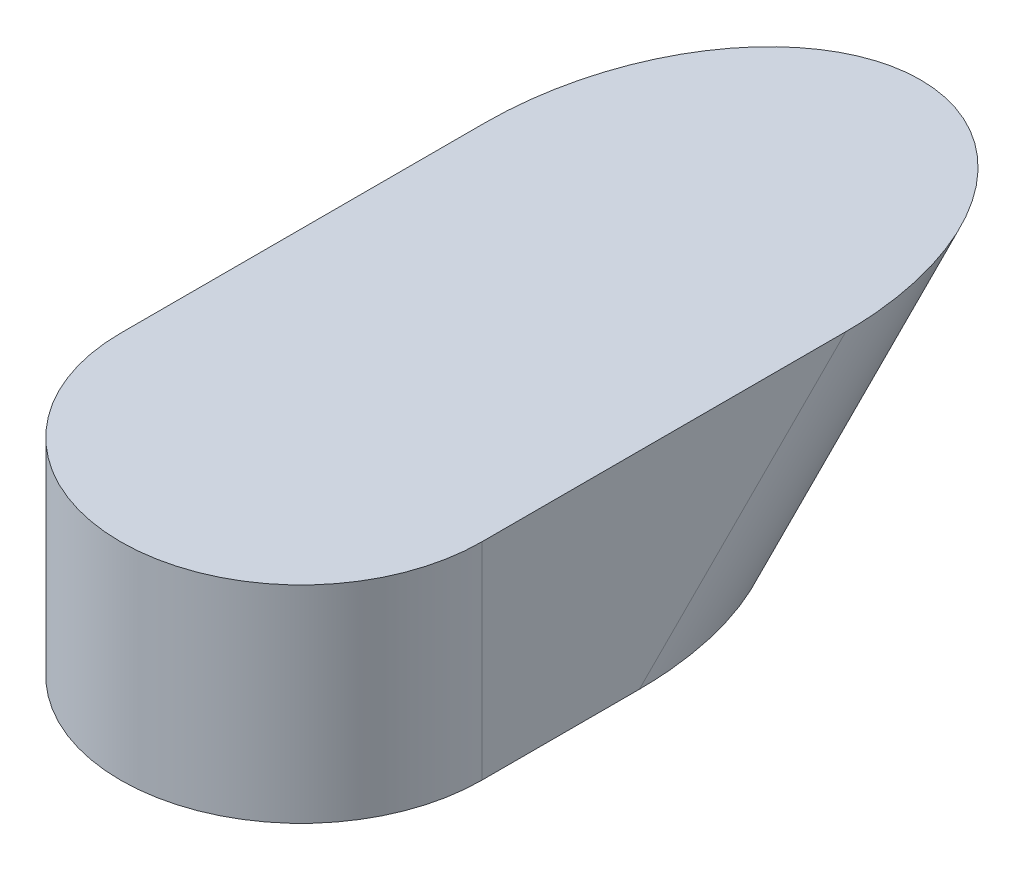
ISO-10303-21;
HEADER;
FILE_DESCRIPTION(('STEP AP214'),'2;1');
FILE_NAME('part.step','',(''),(''),'','','');
FILE_SCHEMA(('AUTOMOTIVE_DESIGN { 1 0 10303 214 1 1 1 1 }'));
ENDSEC;
DATA;
#1=APPLICATION_CONTEXT('core data for automotive mechanical design processes');
#2=APPLICATION_PROTOCOL_DEFINITION('international standard','automotive_design',2000,#1);
#3=PRODUCT_CONTEXT('',#1,'mechanical');
#4=PRODUCT('Part','Part','',(#3));
#5=PRODUCT_RELATED_PRODUCT_CATEGORY('part','',(#4));
#6=PRODUCT_DEFINITION_FORMATION('','',#4);
#7=PRODUCT_DEFINITION_CONTEXT('part definition',#1,'design');
#8=PRODUCT_DEFINITION('design','',#6,#7);
#9=PRODUCT_DEFINITION_SHAPE('','',#8);
#10=(LENGTH_UNIT() NAMED_UNIT(*) SI_UNIT(.MILLI.,.METRE.));
#11=(NAMED_UNIT(*) PLANE_ANGLE_UNIT() SI_UNIT($,.RADIAN.));
#12=(NAMED_UNIT(*) SI_UNIT($,.STERADIAN.) SOLID_ANGLE_UNIT());
#13=UNCERTAINTY_MEASURE_WITH_UNIT(LENGTH_MEASURE(1.E-05),#10,'distance_accuracy_value','');
#14=(GEOMETRIC_REPRESENTATION_CONTEXT(3) GLOBAL_UNCERTAINTY_ASSIGNED_CONTEXT((#13)) GLOBAL_UNIT_ASSIGNED_CONTEXT((#10,
#11,#12)) REPRESENTATION_CONTEXT('',''));
#15=CARTESIAN_POINT('',(0.,0.,0.));
#16=DIRECTION('',(0.,0.,1.));
#17=DIRECTION('',(1.,0.,0.));
#18=AXIS2_PLACEMENT_3D('',#15,#16,#17);
#19=CARTESIAN_POINT('',(0.,-4.,13.44974747));
#20=DIRECTION('',(0.,-1.,0.));
#21=DIRECTION('',(0.,0.,-1.));
#22=AXIS2_PLACEMENT_3D('',#19,#20,#21);
#23=PLANE('',#22);
#24=DIRECTION('',(0.,0.,-1.));
#25=VECTOR('',#24,1.);
#26=CARTESIAN_POINT('',(-3.5,-4.,15.0606601726269));
#27=LINE('',#26,#25);
#28=CARTESIAN_POINT('',(-3.5,-4.,18.));
#29=VERTEX_POINT('',#28);
#30=CARTESIAN_POINT('',(-3.5,-4.,14.94974747));
#31=VERTEX_POINT('',#30);
#32=EDGE_CURVE('E58',#29,#31,#27,.T.);
#33=ORIENTED_EDGE('',*,*,#32,.T.);
#34=CARTESIAN_POINT('',(0.,-4.,14.94974747));
#35=DIRECTION('',(0.,-1.,0.));
#36=DIRECTION('',(0.,0.,1.));
#37=AXIS2_PLACEMENT_3D('',#34,#35,#36);
#38=ELLIPSE('',#37,4.94974746830584,3.5);
#39=CARTESIAN_POINT('',(3.5,-4.,14.94974747));
#40=VERTEX_POINT('',#39);
#41=EDGE_CURVE('E20',#40,#31,#38,.F.);
#42=ORIENTED_EDGE('',*,*,#41,.F.);
#43=DIRECTION('',(0.,0.,-1.));
#44=VECTOR('',#43,1.);
#45=CARTESIAN_POINT('',(3.5,-4.,15.0606601726269));
#46=LINE('',#45,#44);
#47=CARTESIAN_POINT('',(3.5,-4.,18.));
#48=VERTEX_POINT('',#47);
#49=EDGE_CURVE('E56',#48,#40,#46,.T.);
#50=ORIENTED_EDGE('',*,*,#49,.F.);
#51=CARTESIAN_POINT('',(0.,-4.,18.));
#52=DIRECTION('',(0.,-1.,0.));
#53=DIRECTION('',(0.,0.,-1.));
#54=AXIS2_PLACEMENT_3D('',#51,#52,#53);
#55=CIRCLE('',#54,3.5);
#56=EDGE_CURVE('E83',#29,#48,#55,.F.);
#57=ORIENTED_EDGE('',*,*,#56,.F.);
#58=EDGE_LOOP('',(#33,#42,#50,#57));
#59=FACE_BOUND('',#58,.T.);
#60=ADVANCED_FACE('F17',(#59),#23,.T.);
#61=CARTESIAN_POINT('',(0.,3.45279360658424E-11,10.9497474699655));
#62=DIRECTION('',(0.,-0.707106781186547,0.707106781186548));
#63=DIRECTION('',(0.,-0.707106781186548,-0.707106781186547));
#64=AXIS2_PLACEMENT_3D('',#61,#62,#63);
#65=CYLINDRICAL_SURFACE('',#64,3.5);
#66=DIRECTION('',(0.,0.707106781186548,-0.707106781186548));
#67=VECTOR('',#66,1.);
#68=CARTESIAN_POINT('',(-3.5,-4.,14.94974747));
#69=LINE('',#68,#67);
#70=CARTESIAN_POINT('',(-3.5,0.,10.94974747));
#71=VERTEX_POINT('',#70);
#72=EDGE_CURVE('E78',#31,#71,#69,.T.);
#73=ORIENTED_EDGE('',*,*,#72,.T.);
#74=CARTESIAN_POINT('',(0.,0.,10.94974747));
#75=DIRECTION('',(0.,-1.,0.));
#76=DIRECTION('',(0.,0.,1.));
#77=AXIS2_PLACEMENT_3D('',#74,#75,#76);
#78=ELLIPSE('',#77,4.94974746830584,3.5);
#79=CARTESIAN_POINT('',(3.5,0.,10.94974747));
#80=VERTEX_POINT('',#79);
#81=EDGE_CURVE('E73',#71,#80,#78,.T.);
#82=ORIENTED_EDGE('',*,*,#81,.T.);
#83=DIRECTION('',(0.,0.707106781186548,-0.707106781186548));
#84=VECTOR('',#83,1.);
#85=CARTESIAN_POINT('',(3.5,-4.,14.94974747));
#86=LINE('',#85,#84);
#87=EDGE_CURVE('E63',#40,#80,#86,.T.);
#88=ORIENTED_EDGE('',*,*,#87,.F.);
#89=ORIENTED_EDGE('',*,*,#41,.T.);
#90=EDGE_LOOP('',(#73,#82,#88,#89));
#91=FACE_BOUND('',#90,.T.);
#92=ADVANCED_FACE('F72',(#91),#65,.T.);
#93=CARTESIAN_POINT('',(3.5,-1.59508758864569,15.0606601726269));
#94=DIRECTION('',(1.,0.,0.));
#95=DIRECTION('',(0.,0.,-1.));
#96=AXIS2_PLACEMENT_3D('',#93,#94,#95);
#97=PLANE('',#96);
#98=DIRECTION('',(0.,-1.,0.));
#99=VECTOR('',#98,1.);
#100=CARTESIAN_POINT('',(3.5,-2.,18.));
#101=LINE('',#100,#99);
#102=CARTESIAN_POINT('',(3.5,0.,18.));
#103=VERTEX_POINT('',#102);
#104=EDGE_CURVE('E69',#48,#103,#101,.F.);
#105=ORIENTED_EDGE('',*,*,#104,.F.);
#106=ORIENTED_EDGE('',*,*,#49,.T.);
#107=ORIENTED_EDGE('',*,*,#87,.T.);
#108=DIRECTION('',(0.,0.,-1.));
#109=VECTOR('',#108,1.);
#110=CARTESIAN_POINT('',(3.5,0.,13.44974747));
#111=LINE('',#110,#109);
#112=EDGE_CURVE('E82',#80,#103,#111,.F.);
#113=ORIENTED_EDGE('',*,*,#112,.T.);
#114=EDGE_LOOP('',(#105,#106,#107,#113));
#115=FACE_BOUND('',#114,.T.);
#116=ADVANCED_FACE('F66',(#115),#97,.T.);
#117=CARTESIAN_POINT('',(0.,-2.,18.));
#118=DIRECTION('',(0.,-1.,0.));
#119=DIRECTION('',(0.,0.,-1.));
#120=AXIS2_PLACEMENT_3D('',#117,#118,#119);
#121=CYLINDRICAL_SURFACE('',#120,3.5);
#122=DIRECTION('',(0.,1.,0.));
#123=VECTOR('',#122,1.);
#124=CARTESIAN_POINT('',(-3.5,-1.59508758864569,18.));
#125=LINE('',#124,#123);
#126=CARTESIAN_POINT('',(-3.5,0.,18.));
#127=VERTEX_POINT('',#126);
#128=EDGE_CURVE('E34',#127,#29,#125,.F.);
#129=ORIENTED_EDGE('',*,*,#128,.T.);
#130=ORIENTED_EDGE('',*,*,#56,.T.);
#131=ORIENTED_EDGE('',*,*,#104,.T.);
#132=CARTESIAN_POINT('',(0.,0.,18.));
#133=DIRECTION('',(0.,-1.,0.));
#134=DIRECTION('',(0.,0.,-1.));
#135=AXIS2_PLACEMENT_3D('',#132,#133,#134);
#136=CIRCLE('',#135,3.5);
#137=EDGE_CURVE('E26',#103,#127,#136,.T.);
#138=ORIENTED_EDGE('',*,*,#137,.T.);
#139=EDGE_LOOP('',(#129,#130,#131,#138));
#140=FACE_BOUND('',#139,.T.);
#141=ADVANCED_FACE('F87',(#140),#121,.T.);
#142=CARTESIAN_POINT('',(-3.5,-1.59508758864569,15.0606601726269));
#143=DIRECTION('',(1.,0.,0.));
#144=DIRECTION('',(0.,0.,-1.));
#145=AXIS2_PLACEMENT_3D('',#142,#143,#144);
#146=PLANE('',#145);
#147=ORIENTED_EDGE('',*,*,#72,.F.);
#148=ORIENTED_EDGE('',*,*,#32,.F.);
#149=ORIENTED_EDGE('',*,*,#128,.F.);
#150=DIRECTION('',(0.,0.,-1.));
#151=VECTOR('',#150,1.);
#152=CARTESIAN_POINT('',(-3.5,0.,13.44974747));
#153=LINE('',#152,#151);
#154=EDGE_CURVE('E11',#127,#71,#153,.T.);
#155=ORIENTED_EDGE('',*,*,#154,.T.);
#156=EDGE_LOOP('',(#147,#148,#149,#155));
#157=FACE_BOUND('',#156,.T.);
#158=ADVANCED_FACE('F91',(#157),#146,.F.);
#159=CARTESIAN_POINT('',(0.,0.,13.44974747));
#160=DIRECTION('',(0.,-1.,0.));
#161=DIRECTION('',(0.,0.,-1.));
#162=AXIS2_PLACEMENT_3D('',#159,#160,#161);
#163=PLANE('',#162);
#164=ORIENTED_EDGE('',*,*,#137,.F.);
#165=ORIENTED_EDGE('',*,*,#112,.F.);
#166=ORIENTED_EDGE('',*,*,#81,.F.);
#167=ORIENTED_EDGE('',*,*,#154,.F.);
#168=EDGE_LOOP('',(#164,#165,#166,#167));
#169=FACE_BOUND('',#168,.T.);
#170=ADVANCED_FACE('F89',(#169),#163,.F.);
#171=CLOSED_SHELL('',(#60,#92,#116,#141,#158,#170));
#172=MANIFOLD_SOLID_BREP('B1',#171);
#173=ADVANCED_BREP_SHAPE_REPRESENTATION('',(#18,#172),#14);
#174=SHAPE_DEFINITION_REPRESENTATION(#9,#173);
ENDSEC;
END-ISO-10303-21;
